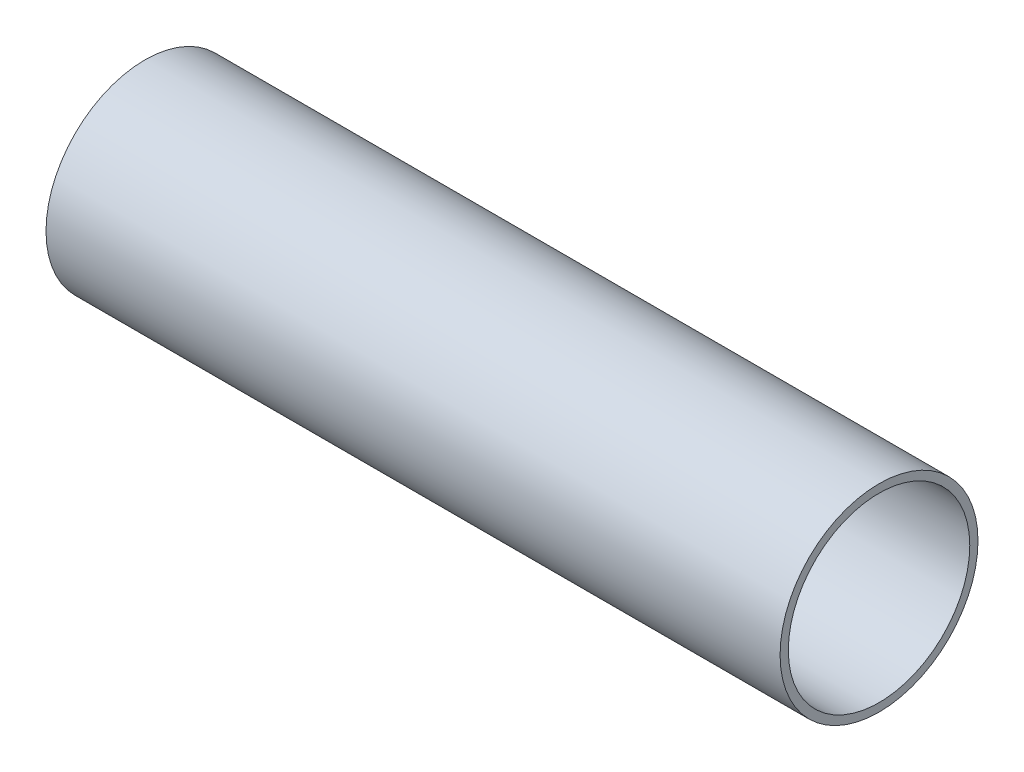
ISO-10303-21;
HEADER;
FILE_DESCRIPTION(('STEP AP214'),'2;1');
FILE_NAME('part.step','',(''),(''),'','','');
FILE_SCHEMA(('AUTOMOTIVE_DESIGN { 1 0 10303 214 1 1 1 1 }'));
ENDSEC;
DATA;
#1=APPLICATION_CONTEXT('core data for automotive mechanical design processes');
#2=APPLICATION_PROTOCOL_DEFINITION('international standard','automotive_design',2000,#1);
#3=PRODUCT_CONTEXT('',#1,'mechanical');
#4=PRODUCT('Part','Part','',(#3));
#5=PRODUCT_RELATED_PRODUCT_CATEGORY('part','',(#4));
#6=PRODUCT_DEFINITION_FORMATION('','',#4);
#7=PRODUCT_DEFINITION_CONTEXT('part definition',#1,'design');
#8=PRODUCT_DEFINITION('design','',#6,#7);
#9=PRODUCT_DEFINITION_SHAPE('','',#8);
#10=(LENGTH_UNIT() NAMED_UNIT(*) SI_UNIT(.MILLI.,.METRE.));
#11=(NAMED_UNIT(*) PLANE_ANGLE_UNIT() SI_UNIT($,.RADIAN.));
#12=(NAMED_UNIT(*) SI_UNIT($,.STERADIAN.) SOLID_ANGLE_UNIT());
#13=UNCERTAINTY_MEASURE_WITH_UNIT(LENGTH_MEASURE(1.E-05),#10,'distance_accuracy_value','');
#14=(GEOMETRIC_REPRESENTATION_CONTEXT(3) GLOBAL_UNCERTAINTY_ASSIGNED_CONTEXT((#13)) GLOBAL_UNIT_ASSIGNED_CONTEXT((#10,
#11,#12)) REPRESENTATION_CONTEXT('',''));
#15=CARTESIAN_POINT('',(0.,0.,0.));
#16=DIRECTION('',(0.,0.,1.));
#17=DIRECTION('',(1.,0.,0.));
#18=AXIS2_PLACEMENT_3D('',#15,#16,#17);
#19=CARTESIAN_POINT('',(0.,0.,0.));
#20=DIRECTION('',(1.,0.,0.));
#21=DIRECTION('',(0.,0.,-1.));
#22=AXIS2_PLACEMENT_3D('',#19,#20,#21);
#23=CYLINDRICAL_SURFACE('',#22,15.45);
#24=CARTESIAN_POINT('',(0.,0.,0.));
#25=DIRECTION('',(1.,0.,0.));
#26=DIRECTION('',(0.,0.,-1.));
#27=AXIS2_PLACEMENT_3D('',#24,#25,#26);
#28=CIRCLE('',#27,15.45);
#29=CARTESIAN_POINT('',(0.,0.,-15.45));
#30=VERTEX_POINT('',#29);
#31=EDGE_CURVE('E27',#30,#30,#28,.T.);
#32=ORIENTED_EDGE('',*,*,#31,.F.);
#33=EDGE_LOOP('',(#32));
#34=FACE_BOUND('',#33,.T.);
#35=CARTESIAN_POINT('',(125.,0.,0.));
#36=DIRECTION('',(1.,0.,0.));
#37=DIRECTION('',(0.,0.,-1.));
#38=AXIS2_PLACEMENT_3D('',#35,#36,#37);
#39=CIRCLE('',#38,15.45);
#40=CARTESIAN_POINT('',(125.,0.,-15.45));
#41=VERTEX_POINT('',#40);
#42=EDGE_CURVE('E18',#41,#41,#39,.T.);
#43=ORIENTED_EDGE('',*,*,#42,.T.);
#44=EDGE_LOOP('',(#43));
#45=FACE_BOUND('',#44,.T.);
#46=ADVANCED_FACE('F15',(#34,#45),#23,.F.);
#47=CARTESIAN_POINT('',(125.,0.,0.));
#48=DIRECTION('',(-1.,0.,0.));
#49=DIRECTION('',(0.,0.,1.));
#50=AXIS2_PLACEMENT_3D('',#47,#48,#49);
#51=PLANE('',#50);
#52=ORIENTED_EDGE('',*,*,#42,.F.);
#53=EDGE_LOOP('',(#52));
#54=FACE_BOUND('',#53,.T.);
#55=CARTESIAN_POINT('',(125.,0.,0.));
#56=DIRECTION('',(1.,0.,0.));
#57=DIRECTION('',(0.,0.,-1.));
#58=AXIS2_PLACEMENT_3D('',#55,#56,#57);
#59=CIRCLE('',#58,16.85);
#60=CARTESIAN_POINT('',(125.,0.,-16.85));
#61=VERTEX_POINT('',#60);
#62=EDGE_CURVE('E22',#61,#61,#59,.F.);
#63=ORIENTED_EDGE('',*,*,#62,.F.);
#64=EDGE_LOOP('',(#63));
#65=FACE_BOUND('',#64,.T.);
#66=ADVANCED_FACE('F36',(#54,#65),#51,.F.);
#67=CARTESIAN_POINT('',(0.,0.,0.));
#68=DIRECTION('',(-1.,0.,0.));
#69=DIRECTION('',(0.,0.,1.));
#70=AXIS2_PLACEMENT_3D('',#67,#68,#69);
#71=PLANE('',#70);
#72=ORIENTED_EDGE('',*,*,#31,.T.);
#73=EDGE_LOOP('',(#72));
#74=FACE_BOUND('',#73,.T.);
#75=CARTESIAN_POINT('',(0.,0.,0.));
#76=DIRECTION('',(1.,0.,0.));
#77=DIRECTION('',(0.,0.,-1.));
#78=AXIS2_PLACEMENT_3D('',#75,#76,#77);
#79=CIRCLE('',#78,16.85);
#80=CARTESIAN_POINT('',(0.,0.,-16.85));
#81=VERTEX_POINT('',#80);
#82=EDGE_CURVE('E10',#81,#81,#79,.T.);
#83=ORIENTED_EDGE('',*,*,#82,.F.);
#84=EDGE_LOOP('',(#83));
#85=FACE_BOUND('',#84,.T.);
#86=ADVANCED_FACE('F39',(#74,#85),#71,.T.);
#87=CARTESIAN_POINT('',(0.,0.,0.));
#88=DIRECTION('',(1.,0.,0.));
#89=DIRECTION('',(0.,0.,-1.));
#90=AXIS2_PLACEMENT_3D('',#87,#88,#89);
#91=CYLINDRICAL_SURFACE('',#90,16.85);
#92=ORIENTED_EDGE('',*,*,#82,.T.);
#93=EDGE_LOOP('',(#92));
#94=FACE_BOUND('',#93,.T.);
#95=ORIENTED_EDGE('',*,*,#62,.T.);
#96=EDGE_LOOP('',(#95));
#97=FACE_BOUND('',#96,.T.);
#98=ADVANCED_FACE('F42',(#94,#97),#91,.T.);
#99=CLOSED_SHELL('',(#46,#66,#86,#98));
#100=MANIFOLD_SOLID_BREP('B1',#99);
#101=ADVANCED_BREP_SHAPE_REPRESENTATION('',(#18,#100),#14);
#102=SHAPE_DEFINITION_REPRESENTATION(#9,#101);
ENDSEC;
END-ISO-10303-21;
